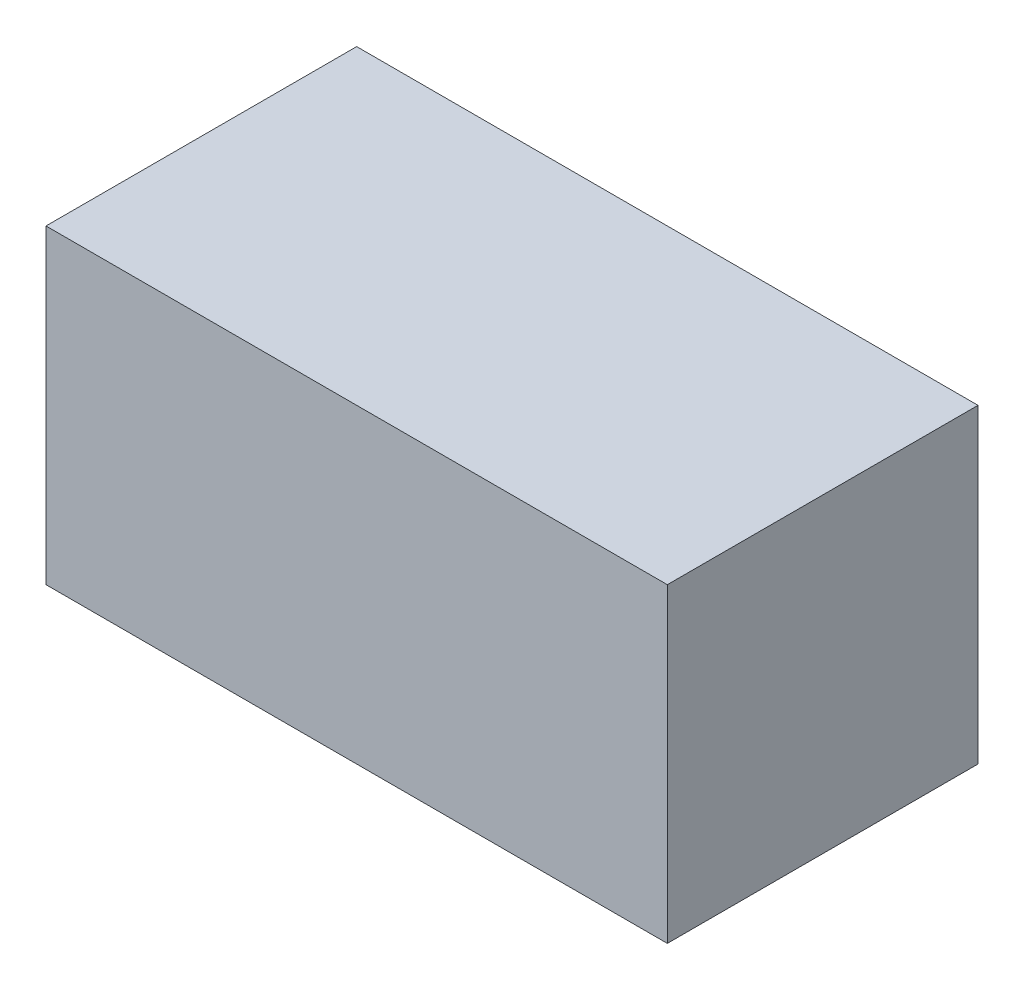
ISO-10303-21;
HEADER;
FILE_DESCRIPTION(('STEP AP214'),'2;1');
FILE_NAME('part.step','',(''),(''),'','','');
FILE_SCHEMA(('AUTOMOTIVE_DESIGN { 1 0 10303 214 1 1 1 1 }'));
ENDSEC;
DATA;
#1=APPLICATION_CONTEXT('core data for automotive mechanical design processes');
#2=APPLICATION_PROTOCOL_DEFINITION('international standard','automotive_design',2000,#1);
#3=PRODUCT_CONTEXT('',#1,'mechanical');
#4=PRODUCT('Part','Part','',(#3));
#5=PRODUCT_RELATED_PRODUCT_CATEGORY('part','',(#4));
#6=PRODUCT_DEFINITION_FORMATION('','',#4);
#7=PRODUCT_DEFINITION_CONTEXT('part definition',#1,'design');
#8=PRODUCT_DEFINITION('design','',#6,#7);
#9=PRODUCT_DEFINITION_SHAPE('','',#8);
#10=(LENGTH_UNIT() NAMED_UNIT(*) SI_UNIT(.MILLI.,.METRE.));
#11=(NAMED_UNIT(*) PLANE_ANGLE_UNIT() SI_UNIT($,.RADIAN.));
#12=(NAMED_UNIT(*) SI_UNIT($,.STERADIAN.) SOLID_ANGLE_UNIT());
#13=UNCERTAINTY_MEASURE_WITH_UNIT(LENGTH_MEASURE(1.E-05),#10,'distance_accuracy_value','');
#14=(GEOMETRIC_REPRESENTATION_CONTEXT(3) GLOBAL_UNCERTAINTY_ASSIGNED_CONTEXT((#13)) GLOBAL_UNIT_ASSIGNED_CONTEXT((#10,
#11,#12)) REPRESENTATION_CONTEXT('',''));
#15=CARTESIAN_POINT('',(0.,0.,0.));
#16=DIRECTION('',(0.,0.,1.));
#17=DIRECTION('',(1.,0.,0.));
#18=AXIS2_PLACEMENT_3D('',#15,#16,#17);
#19=CARTESIAN_POINT('',(0.,0.,0.3));
#20=DIRECTION('',(1.,0.,0.));
#21=DIRECTION('',(0.,0.,-1.));
#22=AXIS2_PLACEMENT_3D('',#19,#20,#21);
#23=PLANE('',#22);
#24=DIRECTION('',(0.,-1.,0.));
#25=VECTOR('',#24,1.);
#26=CARTESIAN_POINT('',(0.,0.,0.));
#27=LINE('',#26,#25);
#28=CARTESIAN_POINT('',(0.,0.3,0.));
#29=VERTEX_POINT('',#28);
#30=CARTESIAN_POINT('',(0.,0.,0.));
#31=VERTEX_POINT('',#30);
#32=EDGE_CURVE('E107',#29,#31,#27,.T.);
#33=ORIENTED_EDGE('',*,*,#32,.T.);
#34=DIRECTION('',(0.,0.,-1.));
#35=VECTOR('',#34,1.);
#36=CARTESIAN_POINT('',(0.,0.,0.3));
#37=LINE('',#36,#35);
#38=CARTESIAN_POINT('',(0.,0.,0.3));
#39=VERTEX_POINT('',#38);
#40=EDGE_CURVE('E11',#39,#31,#37,.T.);
#41=ORIENTED_EDGE('',*,*,#40,.F.);
#42=DIRECTION('',(0.,-1.,0.));
#43=VECTOR('',#42,1.);
#44=CARTESIAN_POINT('',(0.,0.,0.3));
#45=LINE('',#44,#43);
#46=CARTESIAN_POINT('',(0.,0.3,0.3));
#47=VERTEX_POINT('',#46);
#48=EDGE_CURVE('E91',#47,#39,#45,.T.);
#49=ORIENTED_EDGE('',*,*,#48,.F.);
#50=DIRECTION('',(0.,0.,-1.));
#51=VECTOR('',#50,1.);
#52=CARTESIAN_POINT('',(0.,0.3,0.3));
#53=LINE('',#52,#51);
#54=EDGE_CURVE('E103',#47,#29,#53,.T.);
#55=ORIENTED_EDGE('',*,*,#54,.T.);
#56=EDGE_LOOP('',(#33,#41,#49,#55));
#57=FACE_BOUND('',#56,.T.);
#58=ADVANCED_FACE('F39',(#57),#23,.F.);
#59=CARTESIAN_POINT('',(0.,0.,0.3));
#60=DIRECTION('',(0.,1.,0.));
#61=DIRECTION('',(0.,0.,1.));
#62=AXIS2_PLACEMENT_3D('',#59,#60,#61);
#63=PLANE('',#62);
#64=DIRECTION('',(1.,0.,0.));
#65=VECTOR('',#64,1.);
#66=CARTESIAN_POINT('',(0.,0.,0.));
#67=LINE('',#66,#65);
#68=CARTESIAN_POINT('',(0.6,0.,0.));
#69=VERTEX_POINT('',#68);
#70=EDGE_CURVE('E96',#31,#69,#67,.T.);
#71=ORIENTED_EDGE('',*,*,#70,.T.);
#72=DIRECTION('',(0.,0.,-1.));
#73=VECTOR('',#72,1.);
#74=CARTESIAN_POINT('',(0.6,0.,0.3));
#75=LINE('',#74,#73);
#76=CARTESIAN_POINT('',(0.6,0.,0.3));
#77=VERTEX_POINT('',#76);
#78=EDGE_CURVE('E48',#77,#69,#75,.T.);
#79=ORIENTED_EDGE('',*,*,#78,.F.);
#80=DIRECTION('',(1.,0.,0.));
#81=VECTOR('',#80,1.);
#82=CARTESIAN_POINT('',(0.,0.,0.3));
#83=LINE('',#82,#81);
#84=EDGE_CURVE('E86',#39,#77,#83,.T.);
#85=ORIENTED_EDGE('',*,*,#84,.F.);
#86=ORIENTED_EDGE('',*,*,#40,.T.);
#87=EDGE_LOOP('',(#71,#79,#85,#86));
#88=FACE_BOUND('',#87,.T.);
#89=ADVANCED_FACE('F95',(#88),#63,.F.);
#90=CARTESIAN_POINT('',(0.6,0.,0.3));
#91=DIRECTION('',(-1.,0.,0.));
#92=DIRECTION('',(0.,-1.,0.));
#93=AXIS2_PLACEMENT_3D('',#90,#91,#92);
#94=PLANE('',#93);
#95=DIRECTION('',(0.,1.,0.));
#96=VECTOR('',#95,1.);
#97=CARTESIAN_POINT('',(0.6,0.,0.));
#98=LINE('',#97,#96);
#99=CARTESIAN_POINT('',(0.6,0.3,0.));
#100=VERTEX_POINT('',#99);
#101=EDGE_CURVE('E73',#69,#100,#98,.T.);
#102=ORIENTED_EDGE('',*,*,#101,.T.);
#103=DIRECTION('',(0.,0.,-1.));
#104=VECTOR('',#103,1.);
#105=CARTESIAN_POINT('',(0.6,0.3,0.3));
#106=LINE('',#105,#104);
#107=CARTESIAN_POINT('',(0.6,0.3,0.3));
#108=VERTEX_POINT('',#107);
#109=EDGE_CURVE('E98',#108,#100,#106,.T.);
#110=ORIENTED_EDGE('',*,*,#109,.F.);
#111=DIRECTION('',(0.,1.,0.));
#112=VECTOR('',#111,1.);
#113=CARTESIAN_POINT('',(0.6,0.,0.3));
#114=LINE('',#113,#112);
#115=EDGE_CURVE('E89',#77,#108,#114,.T.);
#116=ORIENTED_EDGE('',*,*,#115,.F.);
#117=ORIENTED_EDGE('',*,*,#78,.T.);
#118=EDGE_LOOP('',(#102,#110,#116,#117));
#119=FACE_BOUND('',#118,.T.);
#120=ADVANCED_FACE('F99',(#119),#94,.F.);
#121=CARTESIAN_POINT('',(0.,0.3,0.3));
#122=DIRECTION('',(0.,-1.,0.));
#123=DIRECTION('',(0.,0.,-1.));
#124=AXIS2_PLACEMENT_3D('',#121,#122,#123);
#125=PLANE('',#124);
#126=DIRECTION('',(-1.,0.,0.));
#127=VECTOR('',#126,1.);
#128=CARTESIAN_POINT('',(0.,0.3,0.));
#129=LINE('',#128,#127);
#130=EDGE_CURVE('E79',#100,#29,#129,.T.);
#131=ORIENTED_EDGE('',*,*,#130,.T.);
#132=ORIENTED_EDGE('',*,*,#54,.F.);
#133=DIRECTION('',(-1.,0.,0.));
#134=VECTOR('',#133,1.);
#135=CARTESIAN_POINT('',(0.,0.3,0.3));
#136=LINE('',#135,#134);
#137=EDGE_CURVE('E56',#108,#47,#136,.T.);
#138=ORIENTED_EDGE('',*,*,#137,.F.);
#139=ORIENTED_EDGE('',*,*,#109,.T.);
#140=EDGE_LOOP('',(#131,#132,#138,#139));
#141=FACE_BOUND('',#140,.T.);
#142=ADVANCED_FACE('F120',(#141),#125,.F.);
#143=CARTESIAN_POINT('',(0.,0.,0.3));
#144=DIRECTION('',(0.,0.,-1.));
#145=DIRECTION('',(-1.,0.,0.));
#146=AXIS2_PLACEMENT_3D('',#143,#144,#145);
#147=PLANE('',#146);
#148=ORIENTED_EDGE('',*,*,#48,.T.);
#149=ORIENTED_EDGE('',*,*,#84,.T.);
#150=ORIENTED_EDGE('',*,*,#115,.T.);
#151=ORIENTED_EDGE('',*,*,#137,.T.);
#152=EDGE_LOOP('',(#148,#149,#150,#151));
#153=FACE_BOUND('',#152,.T.);
#154=ADVANCED_FACE('F87',(#153),#147,.F.);
#155=CARTESIAN_POINT('',(0.,0.,0.));
#156=DIRECTION('',(0.,0.,-1.));
#157=DIRECTION('',(-1.,0.,0.));
#158=AXIS2_PLACEMENT_3D('',#155,#156,#157);
#159=PLANE('',#158);
#160=ORIENTED_EDGE('',*,*,#32,.F.);
#161=ORIENTED_EDGE('',*,*,#130,.F.);
#162=ORIENTED_EDGE('',*,*,#101,.F.);
#163=ORIENTED_EDGE('',*,*,#70,.F.);
#164=EDGE_LOOP('',(#160,#161,#162,#163));
#165=FACE_BOUND('',#164,.T.);
#166=ADVANCED_FACE('F123',(#165),#159,.T.);
#167=CLOSED_SHELL('',(#58,#89,#120,#142,#154,#166));
#168=MANIFOLD_SOLID_BREP('B2',#167);
#169=ADVANCED_BREP_SHAPE_REPRESENTATION('',(#18,#168),#14);
#170=SHAPE_DEFINITION_REPRESENTATION(#9,#169);
ENDSEC;
END-ISO-10303-21;
